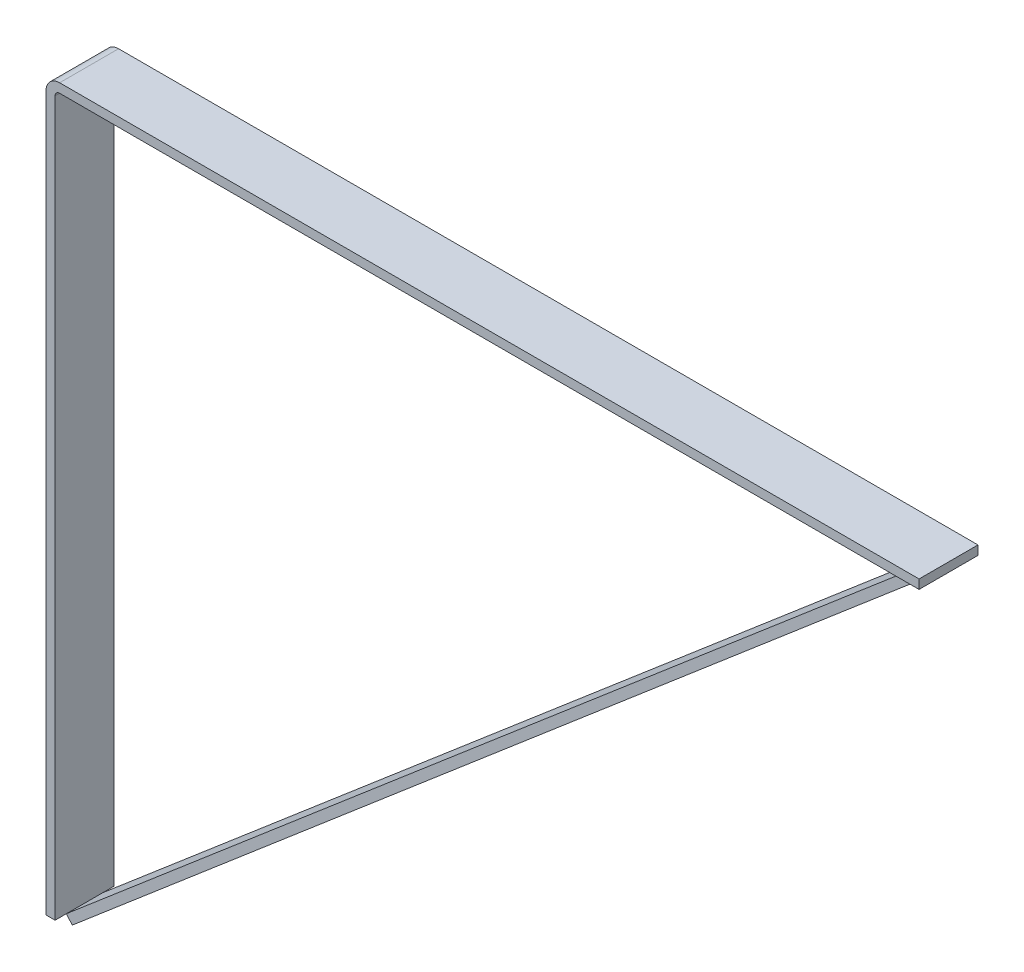
ISO-10303-21;
HEADER;
FILE_DESCRIPTION(('STEP AP214'),'2;1');
FILE_NAME('part.step','',(''),(''),'','','');
FILE_SCHEMA(('AUTOMOTIVE_DESIGN { 1 0 10303 214 1 1 1 1 }'));
ENDSEC;
DATA;
#1=APPLICATION_CONTEXT('core data for automotive mechanical design processes');
#2=APPLICATION_PROTOCOL_DEFINITION('international standard','automotive_design',2000,#1);
#3=PRODUCT_CONTEXT('',#1,'mechanical');
#4=PRODUCT('Part','Part','',(#3));
#5=PRODUCT_RELATED_PRODUCT_CATEGORY('part','',(#4));
#6=PRODUCT_DEFINITION_FORMATION('','',#4);
#7=PRODUCT_DEFINITION_CONTEXT('part definition',#1,'design');
#8=PRODUCT_DEFINITION('design','',#6,#7);
#9=PRODUCT_DEFINITION_SHAPE('','',#8);
#10=(LENGTH_UNIT() NAMED_UNIT(*) SI_UNIT(.MILLI.,.METRE.));
#11=(NAMED_UNIT(*) PLANE_ANGLE_UNIT() SI_UNIT($,.RADIAN.));
#12=(NAMED_UNIT(*) SI_UNIT($,.STERADIAN.) SOLID_ANGLE_UNIT());
#13=UNCERTAINTY_MEASURE_WITH_UNIT(LENGTH_MEASURE(1.E-05),#10,'distance_accuracy_value','');
#14=(GEOMETRIC_REPRESENTATION_CONTEXT(3) GLOBAL_UNCERTAINTY_ASSIGNED_CONTEXT((#13)) GLOBAL_UNIT_ASSIGNED_CONTEXT((#10,
#11,#12)) REPRESENTATION_CONTEXT('',''));
#15=CARTESIAN_POINT('',(0.,0.,0.));
#16=DIRECTION('',(0.,0.,1.));
#17=DIRECTION('',(1.,0.,0.));
#18=AXIS2_PLACEMENT_3D('',#15,#16,#17);
#19=CARTESIAN_POINT('',(285.250366411805,-6.34999999999997,12.7));
#20=DIRECTION('',(0.,-1.,0.));
#21=DIRECTION('',(0.,0.,-1.));
#22=AXIS2_PLACEMENT_3D('',#19,#20,#21);
#23=PLANE('',#22);
#24=DIRECTION('',(-1.,0.,0.));
#25=VECTOR('',#24,1.);
#26=CARTESIAN_POINT('',(285.250366411805,-6.34999999999997,-12.7));
#27=LINE('',#26,#25);
#28=CARTESIAN_POINT('',(295.038551491788,-6.34999999999997,-12.7));
#29=VERTEX_POINT('',#28);
#30=CARTESIAN_POINT('',(285.250366411805,-6.34999999999997,-12.7));
#31=VERTEX_POINT('',#30);
#32=EDGE_CURVE('E112',#29,#31,#27,.T.);
#33=ORIENTED_EDGE('',*,*,#32,.T.);
#34=DIRECTION('',(0.,0.,-1.));
#35=VECTOR('',#34,1.);
#36=CARTESIAN_POINT('',(285.250366411805,-6.34999999999997,12.7));
#37=LINE('',#36,#35);
#38=CARTESIAN_POINT('',(285.250366411805,-6.34999999999997,12.7));
#39=VERTEX_POINT('',#38);
#40=EDGE_CURVE('E12',#39,#31,#37,.T.);
#41=ORIENTED_EDGE('',*,*,#40,.F.);
#42=DIRECTION('',(-1.,0.,0.));
#43=VECTOR('',#42,1.);
#44=CARTESIAN_POINT('',(285.250366411805,-6.34999999999997,12.7));
#45=LINE('',#44,#43);
#46=CARTESIAN_POINT('',(295.038551491788,-6.34999999999997,12.7));
#47=VERTEX_POINT('',#46);
#48=EDGE_CURVE('E100',#47,#39,#45,.T.);
#49=ORIENTED_EDGE('',*,*,#48,.F.);
#50=DIRECTION('',(0.,0.,-1.));
#51=VECTOR('',#50,1.);
#52=CARTESIAN_POINT('',(295.038551491788,-6.34999999999997,12.7));
#53=LINE('',#52,#51);
#54=EDGE_CURVE('E108',#47,#29,#53,.T.);
#55=ORIENTED_EDGE('',*,*,#54,.T.);
#56=EDGE_LOOP('',(#33,#41,#49,#55));
#57=FACE_BOUND('',#56,.T.);
#58=ADVANCED_FACE('F49',(#57),#23,.F.);
#59=CARTESIAN_POINT('',(285.250366411805,-6.34999999999997,12.7));
#60=DIRECTION('',(0.648741308844447,-0.761009010589752,0.));
#61=DIRECTION('',(0.761009010589752,0.648741308844447,0.));
#62=AXIS2_PLACEMENT_3D('',#59,#60,#61);
#63=PLANE('',#62);
#64=DIRECTION('',(-0.761009010589752,-0.648741308844447,0.));
#65=VECTOR('',#64,1.);
#66=CARTESIAN_POINT('',(285.250366411805,-6.34999999999997,-12.7));
#67=LINE('',#66,#65);
#68=CARTESIAN_POINT('',(-303.2125,-508.,-12.7));
#69=VERTEX_POINT('',#68);
#70=EDGE_CURVE('E104',#31,#69,#67,.T.);
#71=ORIENTED_EDGE('',*,*,#70,.T.);
#72=DIRECTION('',(0.,0.,-1.));
#73=VECTOR('',#72,1.);
#74=CARTESIAN_POINT('',(-303.2125,-508.,12.7));
#75=LINE('',#74,#73);
#76=CARTESIAN_POINT('',(-303.2125,-508.,12.7));
#77=VERTEX_POINT('',#76);
#78=EDGE_CURVE('E57',#77,#69,#75,.T.);
#79=ORIENTED_EDGE('',*,*,#78,.F.);
#80=DIRECTION('',(-0.761009010589752,-0.648741308844447,0.));
#81=VECTOR('',#80,1.);
#82=CARTESIAN_POINT('',(285.250366411805,-6.34999999999997,12.7));
#83=LINE('',#82,#81);
#84=EDGE_CURVE('E95',#39,#77,#83,.T.);
#85=ORIENTED_EDGE('',*,*,#84,.F.);
#86=ORIENTED_EDGE('',*,*,#40,.T.);
#87=EDGE_LOOP('',(#71,#79,#85,#86));
#88=FACE_BOUND('',#87,.T.);
#89=ADVANCED_FACE('F103',(#88),#63,.F.);
#90=CARTESIAN_POINT('',(-303.2125,-508.,12.7));
#91=DIRECTION('',(0.761009010589747,0.648741308844453,0.));
#92=DIRECTION('',(-0.648741308844453,0.761009010589747,0.));
#93=AXIS2_PLACEMENT_3D('',#90,#91,#92);
#94=PLANE('',#93);
#95=DIRECTION('',(0.648741308844453,-0.761009010589747,0.));
#96=VECTOR('',#95,1.);
#97=CARTESIAN_POINT('',(-303.2125,-508.,-12.7));
#98=LINE('',#97,#96);
#99=CARTESIAN_POINT('',(-299.092992688837,-512.832407217245,-12.7));
#100=VERTEX_POINT('',#99);
#101=EDGE_CURVE('E82',#69,#100,#98,.T.);
#102=ORIENTED_EDGE('',*,*,#101,.T.);
#103=DIRECTION('',(0.,0.,-1.));
#104=VECTOR('',#103,1.);
#105=CARTESIAN_POINT('',(-299.092992688837,-512.832407217245,12.7));
#106=LINE('',#105,#104);
#107=CARTESIAN_POINT('',(-299.092992688837,-512.832407217245,12.7));
#108=VERTEX_POINT('',#107);
#109=EDGE_CURVE('E105',#108,#100,#106,.T.);
#110=ORIENTED_EDGE('',*,*,#109,.F.);
#111=DIRECTION('',(0.648741308844453,-0.761009010589747,0.));
#112=VECTOR('',#111,1.);
#113=CARTESIAN_POINT('',(-303.2125,-508.,12.7));
#114=LINE('',#113,#112);
#115=EDGE_CURVE('E98',#77,#108,#114,.T.);
#116=ORIENTED_EDGE('',*,*,#115,.F.);
#117=ORIENTED_EDGE('',*,*,#78,.T.);
#118=EDGE_LOOP('',(#102,#110,#116,#117));
#119=FACE_BOUND('',#118,.T.);
#120=ADVANCED_FACE('F106',(#119),#94,.F.);
#121=CARTESIAN_POINT('',(-299.092992688837,-512.832407217245,12.7));
#122=DIRECTION('',(-0.648741308844448,0.761009010589752,0.));
#123=DIRECTION('',(-0.761009010589752,-0.648741308844448,0.));
#124=AXIS2_PLACEMENT_3D('',#121,#122,#123);
#125=PLANE('',#124);
#126=DIRECTION('',(0.761009010589751,0.648741308844448,0.));
#127=VECTOR('',#126,1.);
#128=CARTESIAN_POINT('',(-299.092992688837,-512.832407217245,-12.7));
#129=LINE('',#128,#127);
#130=EDGE_CURVE('E88',#100,#29,#129,.T.);
#131=ORIENTED_EDGE('',*,*,#130,.T.);
#132=ORIENTED_EDGE('',*,*,#54,.F.);
#133=DIRECTION('',(0.761009010589751,0.648741308844448,0.));
#134=VECTOR('',#133,1.);
#135=CARTESIAN_POINT('',(-299.092992688837,-512.832407217245,12.7));
#136=LINE('',#135,#134);
#137=EDGE_CURVE('E65',#108,#47,#136,.T.);
#138=ORIENTED_EDGE('',*,*,#137,.F.);
#139=ORIENTED_EDGE('',*,*,#109,.T.);
#140=EDGE_LOOP('',(#131,#132,#138,#139));
#141=FACE_BOUND('',#140,.T.);
#142=ADVANCED_FACE('F119',(#141),#125,.F.);
#143=CARTESIAN_POINT('',(-730.856684304228,-6.34999999999986,12.7));
#144=DIRECTION('',(0.,0.,-1.));
#145=DIRECTION('',(-1.,0.,0.));
#146=AXIS2_PLACEMENT_3D('',#143,#144,#145);
#147=PLANE('',#146);
#148=ORIENTED_EDGE('',*,*,#48,.T.);
#149=ORIENTED_EDGE('',*,*,#84,.T.);
#150=ORIENTED_EDGE('',*,*,#115,.T.);
#151=ORIENTED_EDGE('',*,*,#137,.T.);
#152=EDGE_LOOP('',(#148,#149,#150,#151));
#153=FACE_BOUND('',#152,.T.);
#154=ADVANCED_FACE('F96',(#153),#147,.F.);
#155=CARTESIAN_POINT('',(-730.856684304228,-6.34999999999986,-12.7));
#156=DIRECTION('',(0.,0.,-1.));
#157=DIRECTION('',(-1.,0.,0.));
#158=AXIS2_PLACEMENT_3D('',#155,#156,#157);
#159=PLANE('',#158);
#160=ORIENTED_EDGE('',*,*,#32,.F.);
#161=ORIENTED_EDGE('',*,*,#130,.F.);
#162=ORIENTED_EDGE('',*,*,#101,.F.);
#163=ORIENTED_EDGE('',*,*,#70,.F.);
#164=EDGE_LOOP('',(#160,#161,#162,#163));
#165=FACE_BOUND('',#164,.T.);
#166=ADVANCED_FACE('F122',(#165),#159,.T.);
#167=CLOSED_SHELL('',(#58,#89,#120,#142,#154,#166));
#168=MANIFOLD_SOLID_BREP('B2',#167);
#169=CARTESIAN_POINT('',(-300.0375,-6.34999999999996,20.574));
#170=DIRECTION('',(0.,1.,0.));
#171=DIRECTION('',(-1.,0.,0.));
#172=AXIS2_PLACEMENT_3D('',#169,#170,#171);
#173=PLANE('',#172);
#174=DIRECTION('',(1.,0.,0.));
#175=VECTOR('',#174,1.);
#176=CARTESIAN_POINT('',(-300.0375,-6.34999999999996,-20.574));
#177=LINE('',#176,#175);
#178=CARTESIAN_POINT('',(-300.0375,-6.34999999999996,-20.574));
#179=VERTEX_POINT('',#178);
#180=CARTESIAN_POINT('',(300.0375,-6.35,-20.574));
#181=VERTEX_POINT('',#180);
#182=EDGE_CURVE('E276',#179,#181,#177,.T.);
#183=ORIENTED_EDGE('',*,*,#182,.T.);
#184=DIRECTION('',(0.,0.,-1.));
#185=VECTOR('',#184,1.);
#186=CARTESIAN_POINT('',(300.0375,-6.35,20.574));
#187=LINE('',#186,#185);
#188=CARTESIAN_POINT('',(300.0375,-6.35,20.574));
#189=VERTEX_POINT('',#188);
#190=EDGE_CURVE('E47',#189,#181,#187,.T.);
#191=ORIENTED_EDGE('',*,*,#190,.F.);
#192=DIRECTION('',(1.,0.,0.));
#193=VECTOR('',#192,1.);
#194=CARTESIAN_POINT('',(-300.0375,-6.34999999999996,20.574));
#195=LINE('',#194,#193);
#196=CARTESIAN_POINT('',(-300.0375,-6.34999999999996,20.574));
#197=VERTEX_POINT('',#196);
#198=EDGE_CURVE('E229',#197,#189,#195,.T.);
#199=ORIENTED_EDGE('',*,*,#198,.F.);
#200=DIRECTION('',(0.,0.,-1.));
#201=VECTOR('',#200,1.);
#202=CARTESIAN_POINT('',(-300.0375,-6.34999999999996,20.574));
#203=LINE('',#202,#201);
#204=EDGE_CURVE('E275',#197,#179,#203,.T.);
#205=ORIENTED_EDGE('',*,*,#204,.T.);
#206=EDGE_LOOP('',(#183,#191,#199,#205));
#207=FACE_BOUND('',#206,.T.);
#208=ADVANCED_FACE('F173',(#207),#173,.F.);
#209=CARTESIAN_POINT('',(300.0375,0.,20.574));
#210=DIRECTION('',(1.,0.,0.));
#211=DIRECTION('',(0.,0.,-1.));
#212=AXIS2_PLACEMENT_3D('',#209,#210,#211);
#213=PLANE('',#212);
#214=DIRECTION('',(0.,-1.,0.));
#215=VECTOR('',#214,1.);
#216=CARTESIAN_POINT('',(300.0375,0.,-20.574));
#217=LINE('',#216,#215);
#218=CARTESIAN_POINT('',(300.0375,0.,-20.574));
#219=VERTEX_POINT('',#218);
#220=EDGE_CURVE('E280',#219,#181,#217,.T.);
#221=ORIENTED_EDGE('',*,*,#220,.F.);
#222=DIRECTION('',(0.,0.,-1.));
#223=VECTOR('',#222,1.);
#224=CARTESIAN_POINT('',(300.0375,0.,20.574));
#225=LINE('',#224,#223);
#226=CARTESIAN_POINT('',(300.0375,0.,20.574));
#227=VERTEX_POINT('',#226);
#228=EDGE_CURVE('E182',#227,#219,#225,.T.);
#229=ORIENTED_EDGE('',*,*,#228,.F.);
#230=DIRECTION('',(0.,-1.,0.));
#231=VECTOR('',#230,1.);
#232=CARTESIAN_POINT('',(300.0375,0.,20.574));
#233=LINE('',#232,#231);
#234=EDGE_CURVE('E332',#227,#189,#233,.T.);
#235=ORIENTED_EDGE('',*,*,#234,.T.);
#236=ORIENTED_EDGE('',*,*,#190,.T.);
#237=EDGE_LOOP('',(#221,#229,#235,#236));
#238=FACE_BOUND('',#237,.T.);
#239=ADVANCED_FACE('F323',(#238),#213,.T.);
#240=CARTESIAN_POINT('',(-300.0375,0.,20.574));
#241=DIRECTION('',(0.,1.,0.));
#242=DIRECTION('',(-1.,0.,0.));
#243=AXIS2_PLACEMENT_3D('',#240,#241,#242);
#244=PLANE('',#243);
#245=DIRECTION('',(1.,0.,0.));
#246=VECTOR('',#245,1.);
#247=CARTESIAN_POINT('',(-300.0375,0.,-20.574));
#248=LINE('',#247,#246);
#249=CARTESIAN_POINT('',(-300.0375,0.,-20.574));
#250=VERTEX_POINT('',#249);
#251=EDGE_CURVE('E284',#250,#219,#248,.T.);
#252=ORIENTED_EDGE('',*,*,#251,.F.);
#253=DIRECTION('',(0.,0.,-1.));
#254=VECTOR('',#253,1.);
#255=CARTESIAN_POINT('',(-300.0375,0.,20.574));
#256=LINE('',#255,#254);
#257=CARTESIAN_POINT('',(-300.0375,0.,20.574));
#258=VERTEX_POINT('',#257);
#259=EDGE_CURVE('E311',#258,#250,#256,.T.);
#260=ORIENTED_EDGE('',*,*,#259,.F.);
#261=DIRECTION('',(1.,0.,0.));
#262=VECTOR('',#261,1.);
#263=CARTESIAN_POINT('',(-300.0375,0.,20.574));
#264=LINE('',#263,#262);
#265=EDGE_CURVE('E320',#258,#227,#264,.T.);
#266=ORIENTED_EDGE('',*,*,#265,.T.);
#267=ORIENTED_EDGE('',*,*,#228,.T.);
#268=EDGE_LOOP('',(#252,#260,#266,#267));
#269=FACE_BOUND('',#268,.T.);
#270=ADVANCED_FACE('F318',(#269),#244,.T.);
#271=CARTESIAN_POINT('',(-300.0375,-9.525,20.574));
#272=DIRECTION('',(0.,0.,-1.));
#273=DIRECTION('',(-1.,0.,0.));
#274=AXIS2_PLACEMENT_3D('',#271,#272,#273);
#275=CYLINDRICAL_SURFACE('',#274,9.52499999999999);
#276=CARTESIAN_POINT('',(-300.0375,-9.525,-20.574));
#277=DIRECTION('',(0.,0.,-1.));
#278=DIRECTION('',(-1.,0.,0.));
#279=AXIS2_PLACEMENT_3D('',#276,#277,#278);
#280=CIRCLE('',#279,9.52499999999999);
#281=CARTESIAN_POINT('',(-309.5625,-9.525,-20.574));
#282=VERTEX_POINT('',#281);
#283=EDGE_CURVE('E288',#282,#250,#280,.T.);
#284=ORIENTED_EDGE('',*,*,#283,.F.);
#285=DIRECTION('',(0.,0.,-1.));
#286=VECTOR('',#285,1.);
#287=CARTESIAN_POINT('',(-309.5625,-9.525,20.574));
#288=LINE('',#287,#286);
#289=CARTESIAN_POINT('',(-309.5625,-9.525,20.574));
#290=VERTEX_POINT('',#289);
#291=EDGE_CURVE('E308',#290,#282,#288,.T.);
#292=ORIENTED_EDGE('',*,*,#291,.F.);
#293=CARTESIAN_POINT('',(-300.0375,-9.525,20.574));
#294=DIRECTION('',(0.,0.,-1.));
#295=DIRECTION('',(-1.,0.,0.));
#296=AXIS2_PLACEMENT_3D('',#293,#294,#295);
#297=CIRCLE('',#296,9.52499999999999);
#298=EDGE_CURVE('E269',#290,#258,#297,.T.);
#299=ORIENTED_EDGE('',*,*,#298,.T.);
#300=ORIENTED_EDGE('',*,*,#259,.T.);
#301=EDGE_LOOP('',(#284,#292,#299,#300));
#302=FACE_BOUND('',#301,.T.);
#303=ADVANCED_FACE('F330',(#302),#275,.T.);
#304=CARTESIAN_POINT('',(-309.5625,-508.,20.574));
#305=DIRECTION('',(-1.,0.,0.));
#306=DIRECTION('',(0.,-1.,0.));
#307=AXIS2_PLACEMENT_3D('',#304,#305,#306);
#308=PLANE('',#307);
#309=DIRECTION('',(0.,1.,0.));
#310=VECTOR('',#309,1.);
#311=CARTESIAN_POINT('',(-309.5625,-508.,-20.574));
#312=LINE('',#311,#310);
#313=CARTESIAN_POINT('',(-309.5625,-508.,-20.574));
#314=VERTEX_POINT('',#313);
#315=EDGE_CURVE('E292',#314,#282,#312,.T.);
#316=ORIENTED_EDGE('',*,*,#315,.F.);
#317=DIRECTION('',(0.,0.,-1.));
#318=VECTOR('',#317,1.);
#319=CARTESIAN_POINT('',(-309.5625,-508.,20.574));
#320=LINE('',#319,#318);
#321=CARTESIAN_POINT('',(-309.5625,-508.,20.574));
#322=VERTEX_POINT('',#321);
#323=EDGE_CURVE('E254',#322,#314,#320,.T.);
#324=ORIENTED_EDGE('',*,*,#323,.F.);
#325=DIRECTION('',(0.,1.,0.));
#326=VECTOR('',#325,1.);
#327=CARTESIAN_POINT('',(-309.5625,-508.,20.574));
#328=LINE('',#327,#326);
#329=EDGE_CURVE('E265',#322,#290,#328,.T.);
#330=ORIENTED_EDGE('',*,*,#329,.T.);
#331=ORIENTED_EDGE('',*,*,#291,.T.);
#332=EDGE_LOOP('',(#316,#324,#330,#331));
#333=FACE_BOUND('',#332,.T.);
#334=ADVANCED_FACE('F341',(#333),#308,.T.);
#335=CARTESIAN_POINT('',(-303.2125,-508.,20.574));
#336=DIRECTION('',(0.,-1.,0.));
#337=DIRECTION('',(0.,0.,-1.));
#338=AXIS2_PLACEMENT_3D('',#335,#336,#337);
#339=PLANE('',#338);
#340=DIRECTION('',(-1.,0.,0.));
#341=VECTOR('',#340,1.);
#342=CARTESIAN_POINT('',(-303.2125,-508.,-20.574));
#343=LINE('',#342,#341);
#344=CARTESIAN_POINT('',(-303.2125,-508.,-20.574));
#345=VERTEX_POINT('',#344);
#346=EDGE_CURVE('E252',#345,#314,#343,.T.);
#347=ORIENTED_EDGE('',*,*,#346,.F.);
#348=DIRECTION('',(0.,0.,-1.));
#349=VECTOR('',#348,1.);
#350=CARTESIAN_POINT('',(-303.2125,-508.,20.574));
#351=LINE('',#350,#349);
#352=CARTESIAN_POINT('',(-303.2125,-508.,20.574));
#353=VERTEX_POINT('',#352);
#354=EDGE_CURVE('E246',#353,#345,#351,.T.);
#355=ORIENTED_EDGE('',*,*,#354,.F.);
#356=DIRECTION('',(-1.,0.,0.));
#357=VECTOR('',#356,1.);
#358=CARTESIAN_POINT('',(-303.2125,-508.,20.574));
#359=LINE('',#358,#357);
#360=EDGE_CURVE('E250',#353,#322,#359,.T.);
#361=ORIENTED_EDGE('',*,*,#360,.T.);
#362=ORIENTED_EDGE('',*,*,#323,.T.);
#363=EDGE_LOOP('',(#347,#355,#361,#362));
#364=FACE_BOUND('',#363,.T.);
#365=ADVANCED_FACE('F248',(#364),#339,.T.);
#366=CARTESIAN_POINT('',(-303.2125,-508.,20.574));
#367=DIRECTION('',(-1.,0.,0.));
#368=DIRECTION('',(0.,-1.,0.));
#369=AXIS2_PLACEMENT_3D('',#366,#367,#368);
#370=PLANE('',#369);
#371=DIRECTION('',(0.,1.,0.));
#372=VECTOR('',#371,1.);
#373=CARTESIAN_POINT('',(-303.2125,-508.,-20.574));
#374=LINE('',#373,#372);
#375=CARTESIAN_POINT('',(-303.2125,-9.525,-20.574));
#376=VERTEX_POINT('',#375);
#377=EDGE_CURVE('E217',#345,#376,#374,.T.);
#378=ORIENTED_EDGE('',*,*,#377,.T.);
#379=DIRECTION('',(0.,0.,-1.));
#380=VECTOR('',#379,1.);
#381=CARTESIAN_POINT('',(-303.2125,-9.525,20.574));
#382=LINE('',#381,#380);
#383=CARTESIAN_POINT('',(-303.2125,-9.525,20.574));
#384=VERTEX_POINT('',#383);
#385=EDGE_CURVE('E255',#384,#376,#382,.T.);
#386=ORIENTED_EDGE('',*,*,#385,.F.);
#387=DIRECTION('',(0.,1.,0.));
#388=VECTOR('',#387,1.);
#389=CARTESIAN_POINT('',(-303.2125,-508.,20.574));
#390=LINE('',#389,#388);
#391=EDGE_CURVE('E257',#353,#384,#390,.T.);
#392=ORIENTED_EDGE('',*,*,#391,.F.);
#393=ORIENTED_EDGE('',*,*,#354,.T.);
#394=EDGE_LOOP('',(#378,#386,#392,#393));
#395=FACE_BOUND('',#394,.T.);
#396=ADVANCED_FACE('F258',(#395),#370,.F.);
#397=CARTESIAN_POINT('',(-300.0375,-9.525,20.574));
#398=DIRECTION('',(0.,0.,-1.));
#399=DIRECTION('',(-1.,0.,0.));
#400=AXIS2_PLACEMENT_3D('',#397,#398,#399);
#401=CYLINDRICAL_SURFACE('',#400,3.17499999999999);
#402=CARTESIAN_POINT('',(-300.0375,-9.525,-20.574));
#403=DIRECTION('',(0.,0.,1.));
#404=DIRECTION('',(1.,0.,0.));
#405=AXIS2_PLACEMENT_3D('',#402,#403,#404);
#406=CIRCLE('',#405,3.17499999999999);
#407=EDGE_CURVE('E223',#376,#179,#406,.F.);
#408=ORIENTED_EDGE('',*,*,#407,.T.);
#409=ORIENTED_EDGE('',*,*,#204,.F.);
#410=CARTESIAN_POINT('',(-300.0375,-9.525,20.574));
#411=DIRECTION('',(0.,0.,1.));
#412=DIRECTION('',(1.,0.,0.));
#413=AXIS2_PLACEMENT_3D('',#410,#411,#412);
#414=CIRCLE('',#413,3.17499999999999);
#415=EDGE_CURVE('E190',#384,#197,#414,.F.);
#416=ORIENTED_EDGE('',*,*,#415,.F.);
#417=ORIENTED_EDGE('',*,*,#385,.T.);
#418=EDGE_LOOP('',(#408,#409,#416,#417));
#419=FACE_BOUND('',#418,.T.);
#420=ADVANCED_FACE('F343',(#419),#401,.F.);
#421=CARTESIAN_POINT('',(-300.0375,-9.525,20.574));
#422=DIRECTION('',(0.,0.,-1.));
#423=DIRECTION('',(-1.,0.,0.));
#424=AXIS2_PLACEMENT_3D('',#421,#422,#423);
#425=PLANE('',#424);
#426=ORIENTED_EDGE('',*,*,#198,.T.);
#427=ORIENTED_EDGE('',*,*,#234,.F.);
#428=ORIENTED_EDGE('',*,*,#265,.F.);
#429=ORIENTED_EDGE('',*,*,#298,.F.);
#430=ORIENTED_EDGE('',*,*,#329,.F.);
#431=ORIENTED_EDGE('',*,*,#360,.F.);
#432=ORIENTED_EDGE('',*,*,#391,.T.);
#433=ORIENTED_EDGE('',*,*,#415,.T.);
#434=EDGE_LOOP('',(#426,#427,#428,#429,#430,#431,#432,#433));
#435=FACE_BOUND('',#434,.T.);
#436=ADVANCED_FACE('F262',(#435),#425,.F.);
#437=CARTESIAN_POINT('',(-300.0375,-9.525,-20.574));
#438=DIRECTION('',(0.,0.,-1.));
#439=DIRECTION('',(-1.,0.,0.));
#440=AXIS2_PLACEMENT_3D('',#437,#438,#439);
#441=PLANE('',#440);
#442=ORIENTED_EDGE('',*,*,#182,.F.);
#443=ORIENTED_EDGE('',*,*,#407,.F.);
#444=ORIENTED_EDGE('',*,*,#377,.F.);
#445=ORIENTED_EDGE('',*,*,#346,.T.);
#446=ORIENTED_EDGE('',*,*,#315,.T.);
#447=ORIENTED_EDGE('',*,*,#283,.T.);
#448=ORIENTED_EDGE('',*,*,#251,.T.);
#449=ORIENTED_EDGE('',*,*,#220,.T.);
#450=EDGE_LOOP('',(#442,#443,#444,#445,#446,#447,#448,#449));
#451=FACE_BOUND('',#450,.T.);
#452=ADVANCED_FACE('F326',(#451),#441,.T.);
#453=CLOSED_SHELL('',(#208,#239,#270,#303,#334,#365,#396,#420,#436,#452));
#454=MANIFOLD_SOLID_BREP('B6',#453);
#455=ADVANCED_BREP_SHAPE_REPRESENTATION('',(#18,#168,#454),#14);
#456=SHAPE_DEFINITION_REPRESENTATION(#9,#455);
ENDSEC;
END-ISO-10303-21;
